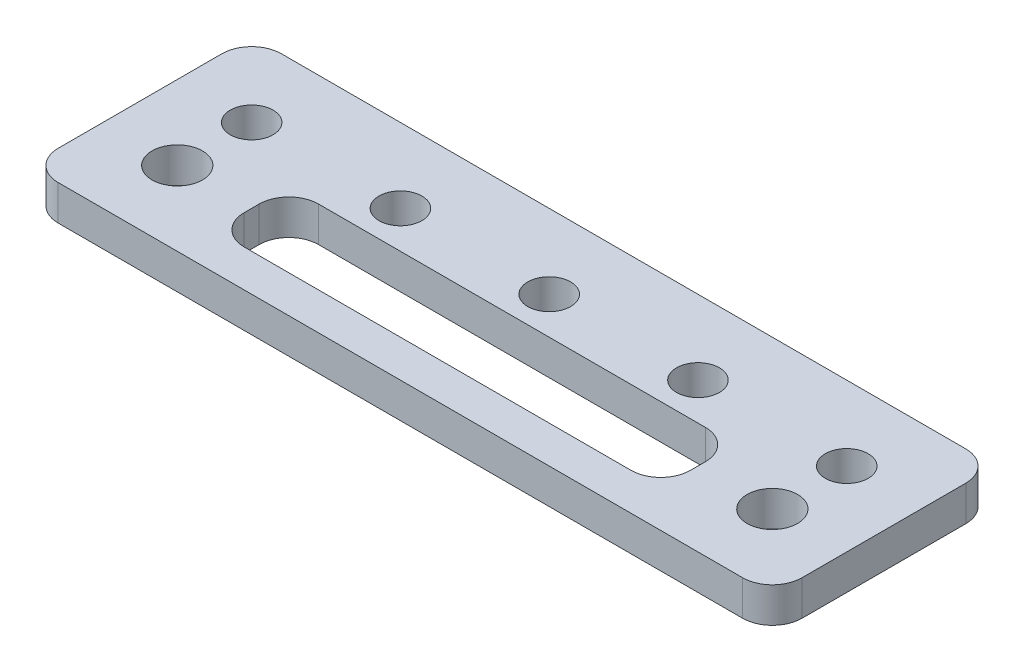
ISO-10303-21;
HEADER;
FILE_DESCRIPTION(('STEP AP214'),'2;1');
FILE_NAME('part.step','',(''),(''),'','','');
FILE_SCHEMA(('AUTOMOTIVE_DESIGN { 1 0 10303 214 1 1 1 1 }'));
ENDSEC;
DATA;
#1=APPLICATION_CONTEXT('core data for automotive mechanical design processes');
#2=APPLICATION_PROTOCOL_DEFINITION('international standard','automotive_design',2000,#1);
#3=PRODUCT_CONTEXT('',#1,'mechanical');
#4=PRODUCT('Part','Part','',(#3));
#5=PRODUCT_RELATED_PRODUCT_CATEGORY('part','',(#4));
#6=PRODUCT_DEFINITION_FORMATION('','',#4);
#7=PRODUCT_DEFINITION_CONTEXT('part definition',#1,'design');
#8=PRODUCT_DEFINITION('design','',#6,#7);
#9=PRODUCT_DEFINITION_SHAPE('','',#8);
#10=(LENGTH_UNIT() NAMED_UNIT(*) SI_UNIT(.MILLI.,.METRE.));
#11=(NAMED_UNIT(*) PLANE_ANGLE_UNIT() SI_UNIT($,.RADIAN.));
#12=(NAMED_UNIT(*) SI_UNIT($,.STERADIAN.) SOLID_ANGLE_UNIT());
#13=UNCERTAINTY_MEASURE_WITH_UNIT(LENGTH_MEASURE(1.E-05),#10,'distance_accuracy_value','');
#14=(GEOMETRIC_REPRESENTATION_CONTEXT(3) GLOBAL_UNCERTAINTY_ASSIGNED_CONTEXT((#13)) GLOBAL_UNIT_ASSIGNED_CONTEXT((#10,
#11,#12)) REPRESENTATION_CONTEXT('',''));
#15=CARTESIAN_POINT('',(0.,0.,0.));
#16=DIRECTION('',(0.,0.,1.));
#17=DIRECTION('',(1.,0.,0.));
#18=AXIS2_PLACEMENT_3D('',#15,#16,#17);
#19=CARTESIAN_POINT('',(-31.75,3.,9.525));
#20=DIRECTION('',(1.,0.,0.));
#21=DIRECTION('',(0.,0.,-1.));
#22=AXIS2_PLACEMENT_3D('',#19,#20,#21);
#23=PLANE('',#22);
#24=DIRECTION('',(0.,0.,1.));
#25=VECTOR('',#24,1.);
#26=CARTESIAN_POINT('',(-31.75,0.,9.525));
#27=LINE('',#26,#25);
#28=CARTESIAN_POINT('',(-31.75,0.,-6.98499999999999));
#29=VERTEX_POINT('',#28);
#30=CARTESIAN_POINT('',(-31.75,0.,6.985));
#31=VERTEX_POINT('',#30);
#32=EDGE_CURVE('E255',#29,#31,#27,.T.);
#33=ORIENTED_EDGE('',*,*,#32,.T.);
#34=DIRECTION('',(0.,-1.,0.));
#35=VECTOR('',#34,1.);
#36=CARTESIAN_POINT('',(-31.75,3.,6.985));
#37=LINE('',#36,#35);
#38=CARTESIAN_POINT('',(-31.75,3.,6.985));
#39=VERTEX_POINT('',#38);
#40=EDGE_CURVE('E11',#31,#39,#37,.F.);
#41=ORIENTED_EDGE('',*,*,#40,.T.);
#42=DIRECTION('',(0.,0.,1.));
#43=VECTOR('',#42,1.);
#44=CARTESIAN_POINT('',(-31.75,3.,9.525));
#45=LINE('',#44,#43);
#46=CARTESIAN_POINT('',(-31.75,3.,-6.98499999999999));
#47=VERTEX_POINT('',#46);
#48=EDGE_CURVE('E256',#47,#39,#45,.T.);
#49=ORIENTED_EDGE('',*,*,#48,.F.);
#50=DIRECTION('',(0.,-1.,0.));
#51=VECTOR('',#50,1.);
#52=CARTESIAN_POINT('',(-31.75,3.,-6.985));
#53=LINE('',#52,#51);
#54=EDGE_CURVE('E41',#47,#29,#53,.T.);
#55=ORIENTED_EDGE('',*,*,#54,.T.);
#56=EDGE_LOOP('',(#33,#41,#49,#55));
#57=FACE_BOUND('',#56,.T.);
#58=ADVANCED_FACE('F33',(#57),#23,.F.);
#59=CARTESIAN_POINT('',(31.75,3.,9.525));
#60=DIRECTION('',(0.,0.,-1.));
#61=DIRECTION('',(-1.,0.,0.));
#62=AXIS2_PLACEMENT_3D('',#59,#60,#61);
#63=PLANE('',#62);
#64=DIRECTION('',(1.,0.,0.));
#65=VECTOR('',#64,1.);
#66=CARTESIAN_POINT('',(31.75,0.,9.525));
#67=LINE('',#66,#65);
#68=CARTESIAN_POINT('',(-29.21,0.,9.525));
#69=VERTEX_POINT('',#68);
#70=CARTESIAN_POINT('',(29.21,0.,9.525));
#71=VERTEX_POINT('',#70);
#72=EDGE_CURVE('E272',#69,#71,#67,.T.);
#73=ORIENTED_EDGE('',*,*,#72,.T.);
#74=DIRECTION('',(0.,-1.,0.));
#75=VECTOR('',#74,1.);
#76=CARTESIAN_POINT('',(29.21,3.,9.525));
#77=LINE('',#76,#75);
#78=CARTESIAN_POINT('',(29.21,3.,9.525));
#79=VERTEX_POINT('',#78);
#80=EDGE_CURVE('E295',#71,#79,#77,.F.);
#81=ORIENTED_EDGE('',*,*,#80,.T.);
#82=DIRECTION('',(1.,0.,0.));
#83=VECTOR('',#82,1.);
#84=CARTESIAN_POINT('',(31.75,3.,9.525));
#85=LINE('',#84,#83);
#86=CARTESIAN_POINT('',(-29.21,3.,9.525));
#87=VERTEX_POINT('',#86);
#88=EDGE_CURVE('E259',#87,#79,#85,.T.);
#89=ORIENTED_EDGE('',*,*,#88,.F.);
#90=DIRECTION('',(0.,-1.,0.));
#91=VECTOR('',#90,1.);
#92=CARTESIAN_POINT('',(-29.21,3.,9.525));
#93=LINE('',#92,#91);
#94=EDGE_CURVE('E292',#87,#69,#93,.T.);
#95=ORIENTED_EDGE('',*,*,#94,.T.);
#96=EDGE_LOOP('',(#73,#81,#89,#95));
#97=FACE_BOUND('',#96,.T.);
#98=ADVANCED_FACE('F327',(#97),#63,.F.);
#99=CARTESIAN_POINT('',(31.75,3.,9.525));
#100=DIRECTION('',(-1.,0.,0.));
#101=DIRECTION('',(0.,0.,1.));
#102=AXIS2_PLACEMENT_3D('',#99,#100,#101);
#103=PLANE('',#102);
#104=DIRECTION('',(0.,0.,-1.));
#105=VECTOR('',#104,1.);
#106=CARTESIAN_POINT('',(31.75,3.,9.525));
#107=LINE('',#106,#105);
#108=CARTESIAN_POINT('',(31.75,3.,6.985));
#109=VERTEX_POINT('',#108);
#110=CARTESIAN_POINT('',(31.75,3.,-6.985));
#111=VERTEX_POINT('',#110);
#112=EDGE_CURVE('E263',#109,#111,#107,.T.);
#113=ORIENTED_EDGE('',*,*,#112,.F.);
#114=DIRECTION('',(0.,-1.,0.));
#115=VECTOR('',#114,1.);
#116=CARTESIAN_POINT('',(31.75,3.,6.98499999999999));
#117=LINE('',#116,#115);
#118=CARTESIAN_POINT('',(31.75,0.,6.985));
#119=VERTEX_POINT('',#118);
#120=EDGE_CURVE('E281',#109,#119,#117,.T.);
#121=ORIENTED_EDGE('',*,*,#120,.T.);
#122=DIRECTION('',(0.,0.,-1.));
#123=VECTOR('',#122,1.);
#124=CARTESIAN_POINT('',(31.75,0.,9.525));
#125=LINE('',#124,#123);
#126=CARTESIAN_POINT('',(31.75,0.,-6.985));
#127=VERTEX_POINT('',#126);
#128=EDGE_CURVE('E275',#119,#127,#125,.T.);
#129=ORIENTED_EDGE('',*,*,#128,.T.);
#130=DIRECTION('',(0.,-1.,0.));
#131=VECTOR('',#130,1.);
#132=CARTESIAN_POINT('',(31.75,3.,-6.985));
#133=LINE('',#132,#131);
#134=EDGE_CURVE('E269',#127,#111,#133,.F.);
#135=ORIENTED_EDGE('',*,*,#134,.T.);
#136=EDGE_LOOP('',(#113,#121,#129,#135));
#137=FACE_BOUND('',#136,.T.);
#138=ADVANCED_FACE('F337',(#137),#103,.F.);
#139=CARTESIAN_POINT('',(31.75,3.,-9.52500000000001));
#140=DIRECTION('',(0.,0.,1.));
#141=DIRECTION('',(1.,0.,0.));
#142=AXIS2_PLACEMENT_3D('',#139,#140,#141);
#143=PLANE('',#142);
#144=DIRECTION('',(-1.,0.,0.));
#145=VECTOR('',#144,1.);
#146=CARTESIAN_POINT('',(31.75,3.,-9.52500000000001));
#147=LINE('',#146,#145);
#148=CARTESIAN_POINT('',(29.21,3.,-9.52500000000001));
#149=VERTEX_POINT('',#148);
#150=CARTESIAN_POINT('',(-29.21,3.,-9.525));
#151=VERTEX_POINT('',#150);
#152=EDGE_CURVE('E266',#149,#151,#147,.T.);
#153=ORIENTED_EDGE('',*,*,#152,.F.);
#154=DIRECTION('',(0.,-1.,0.));
#155=VECTOR('',#154,1.);
#156=CARTESIAN_POINT('',(29.21,3.,-9.52500000000001));
#157=LINE('',#156,#155);
#158=CARTESIAN_POINT('',(29.21,0.,-9.52500000000001));
#159=VERTEX_POINT('',#158);
#160=EDGE_CURVE('E307',#149,#159,#157,.T.);
#161=ORIENTED_EDGE('',*,*,#160,.T.);
#162=DIRECTION('',(-1.,0.,0.));
#163=VECTOR('',#162,1.);
#164=CARTESIAN_POINT('',(31.75,0.,-9.52500000000001));
#165=LINE('',#164,#163);
#166=CARTESIAN_POINT('',(-29.21,0.,-9.525));
#167=VERTEX_POINT('',#166);
#168=EDGE_CURVE('E260',#159,#167,#165,.T.);
#169=ORIENTED_EDGE('',*,*,#168,.T.);
#170=DIRECTION('',(0.,-1.,0.));
#171=VECTOR('',#170,1.);
#172=CARTESIAN_POINT('',(-29.21,3.,-9.525));
#173=LINE('',#172,#171);
#174=EDGE_CURVE('E305',#167,#151,#173,.F.);
#175=ORIENTED_EDGE('',*,*,#174,.T.);
#176=EDGE_LOOP('',(#153,#161,#169,#175));
#177=FACE_BOUND('',#176,.T.);
#178=ADVANCED_FACE('F345',(#177),#143,.F.);
#179=CARTESIAN_POINT('',(0.,3.,0.));
#180=DIRECTION('',(0.,1.,0.));
#181=DIRECTION('',(0.,0.,1.));
#182=AXIS2_PLACEMENT_3D('',#179,#180,#181);
#183=PLANE('',#182);
#184=CARTESIAN_POINT('',(16.51,3.,2.54000000000001));
#185=DIRECTION('',(0.,1.,0.));
#186=DIRECTION('',(0.,0.,1.));
#187=AXIS2_PLACEMENT_3D('',#184,#185,#186);
#188=CIRCLE('',#187,2.54);
#189=CARTESIAN_POINT('',(19.05,3.,2.54000000000001));
#190=VERTEX_POINT('',#189);
#191=CARTESIAN_POINT('',(16.51,3.,0.));
#192=VERTEX_POINT('',#191);
#193=EDGE_CURVE('E48',#190,#192,#188,.T.);
#194=ORIENTED_EDGE('',*,*,#193,.F.);
#195=DIRECTION('',(0.,0.,-1.));
#196=VECTOR('',#195,1.);
#197=CARTESIAN_POINT('',(19.05,3.,3.81));
#198=LINE('',#197,#196);
#199=CARTESIAN_POINT('',(19.05,3.,3.81));
#200=VERTEX_POINT('',#199);
#201=EDGE_CURVE('E164',#200,#190,#198,.T.);
#202=ORIENTED_EDGE('',*,*,#201,.F.);
#203=CARTESIAN_POINT('',(16.51,3.,3.81));
#204=DIRECTION('',(0.,1.,0.));
#205=DIRECTION('',(0.,0.,1.));
#206=AXIS2_PLACEMENT_3D('',#203,#204,#205);
#207=CIRCLE('',#206,2.54);
#208=CARTESIAN_POINT('',(16.51,3.,6.35));
#209=VERTEX_POINT('',#208);
#210=EDGE_CURVE('E167',#209,#200,#207,.T.);
#211=ORIENTED_EDGE('',*,*,#210,.F.);
#212=DIRECTION('',(1.,0.,0.));
#213=VECTOR('',#212,1.);
#214=CARTESIAN_POINT('',(16.51,3.,6.35));
#215=LINE('',#214,#213);
#216=CARTESIAN_POINT('',(-16.51,3.,6.35));
#217=VERTEX_POINT('',#216);
#218=EDGE_CURVE('E195',#217,#209,#215,.T.);
#219=ORIENTED_EDGE('',*,*,#218,.F.);
#220=CARTESIAN_POINT('',(-16.51,3.,3.81));
#221=DIRECTION('',(0.,1.,0.));
#222=DIRECTION('',(0.,0.,-1.));
#223=AXIS2_PLACEMENT_3D('',#220,#221,#222);
#224=CIRCLE('',#223,2.54);
#225=CARTESIAN_POINT('',(-19.05,3.,3.81));
#226=VERTEX_POINT('',#225);
#227=EDGE_CURVE('E192',#226,#217,#224,.T.);
#228=ORIENTED_EDGE('',*,*,#227,.F.);
#229=DIRECTION('',(0.,0.,1.));
#230=VECTOR('',#229,1.);
#231=CARTESIAN_POINT('',(-19.05,3.,3.81));
#232=LINE('',#231,#230);
#233=CARTESIAN_POINT('',(-19.05,3.,2.54000000000001));
#234=VERTEX_POINT('',#233);
#235=EDGE_CURVE('E189',#234,#226,#232,.T.);
#236=ORIENTED_EDGE('',*,*,#235,.F.);
#237=CARTESIAN_POINT('',(-16.51,3.,2.54000000000001));
#238=DIRECTION('',(0.,1.,0.));
#239=DIRECTION('',(0.,0.,1.));
#240=AXIS2_PLACEMENT_3D('',#237,#238,#239);
#241=CIRCLE('',#240,2.54);
#242=CARTESIAN_POINT('',(-16.51,3.,0.));
#243=VERTEX_POINT('',#242);
#244=EDGE_CURVE('E186',#243,#234,#241,.T.);
#245=ORIENTED_EDGE('',*,*,#244,.F.);
#246=DIRECTION('',(-1.,0.,0.));
#247=VECTOR('',#246,1.);
#248=CARTESIAN_POINT('',(16.51,3.,0.));
#249=LINE('',#248,#247);
#250=EDGE_CURVE('E184',#192,#243,#249,.T.);
#251=ORIENTED_EDGE('',*,*,#250,.F.);
#252=EDGE_LOOP('',(#194,#202,#211,#219,#228,#236,#245,#251));
#253=FACE_BOUND('',#252,.T.);
#254=CARTESIAN_POINT('',(-25.4,3.,3.17500000000001));
#255=DIRECTION('',(0.,1.,0.));
#256=DIRECTION('',(0.,0.,1.));
#257=AXIS2_PLACEMENT_3D('',#254,#255,#256);
#258=CIRCLE('',#257,2.15264999999999);
#259=CARTESIAN_POINT('',(-25.4,3.,5.32764999999999));
#260=VERTEX_POINT('',#259);
#261=EDGE_CURVE('E202',#260,#260,#258,.T.);
#262=ORIENTED_EDGE('',*,*,#261,.F.);
#263=EDGE_LOOP('',(#262));
#264=FACE_BOUND('',#263,.T.);
#265=CARTESIAN_POINT('',(25.4,3.,3.175));
#266=DIRECTION('',(0.,1.,0.));
#267=DIRECTION('',(0.,0.,1.));
#268=AXIS2_PLACEMENT_3D('',#265,#266,#267);
#269=CIRCLE('',#268,2.15264999999999);
#270=CARTESIAN_POINT('',(25.4,3.,5.32764999999999));
#271=VERTEX_POINT('',#270);
#272=EDGE_CURVE('E219',#271,#271,#269,.T.);
#273=ORIENTED_EDGE('',*,*,#272,.F.);
#274=EDGE_LOOP('',(#273));
#275=FACE_BOUND('',#274,.T.);
#276=CARTESIAN_POINT('',(-25.4,3.,-3.17499999999999));
#277=DIRECTION('',(0.,1.,0.));
#278=DIRECTION('',(0.,0.,1.));
#279=AXIS2_PLACEMENT_3D('',#276,#277,#278);
#280=CIRCLE('',#279,1.82879999999999);
#281=CARTESIAN_POINT('',(-25.4,3.,-1.34620000000001));
#282=VERTEX_POINT('',#281);
#283=EDGE_CURVE('E225',#282,#282,#280,.T.);
#284=ORIENTED_EDGE('',*,*,#283,.F.);
#285=EDGE_LOOP('',(#284));
#286=FACE_BOUND('',#285,.T.);
#287=CARTESIAN_POINT('',(0.,3.,-3.17499999999999));
#288=DIRECTION('',(0.,1.,0.));
#289=DIRECTION('',(0.,0.,1.));
#290=AXIS2_PLACEMENT_3D('',#287,#288,#289);
#291=CIRCLE('',#290,1.82879999999999);
#292=CARTESIAN_POINT('',(0.,3.,-1.34620000000001));
#293=VERTEX_POINT('',#292);
#294=EDGE_CURVE('E231',#293,#293,#291,.T.);
#295=ORIENTED_EDGE('',*,*,#294,.F.);
#296=EDGE_LOOP('',(#295));
#297=FACE_BOUND('',#296,.T.);
#298=CARTESIAN_POINT('',(25.4,3.,-3.17499999999999));
#299=DIRECTION('',(0.,1.,0.));
#300=DIRECTION('',(0.,0.,1.));
#301=AXIS2_PLACEMENT_3D('',#298,#299,#300);
#302=CIRCLE('',#301,1.82879999999999);
#303=CARTESIAN_POINT('',(25.4,3.,-1.34620000000001));
#304=VERTEX_POINT('',#303);
#305=EDGE_CURVE('E237',#304,#304,#302,.T.);
#306=ORIENTED_EDGE('',*,*,#305,.F.);
#307=EDGE_LOOP('',(#306));
#308=FACE_BOUND('',#307,.T.);
#309=CARTESIAN_POINT('',(12.7,3.,-3.17499999999999));
#310=DIRECTION('',(0.,1.,0.));
#311=DIRECTION('',(0.,0.,1.));
#312=AXIS2_PLACEMENT_3D('',#309,#310,#311);
#313=CIRCLE('',#312,1.82879999999999);
#314=CARTESIAN_POINT('',(12.7,3.,-1.34620000000001));
#315=VERTEX_POINT('',#314);
#316=EDGE_CURVE('E243',#315,#315,#313,.T.);
#317=ORIENTED_EDGE('',*,*,#316,.F.);
#318=EDGE_LOOP('',(#317));
#319=FACE_BOUND('',#318,.T.);
#320=CARTESIAN_POINT('',(-12.7,3.,-3.17499999999999));
#321=DIRECTION('',(0.,1.,0.));
#322=DIRECTION('',(0.,0.,1.));
#323=AXIS2_PLACEMENT_3D('',#320,#321,#322);
#324=CIRCLE('',#323,1.82879999999999);
#325=CARTESIAN_POINT('',(-12.7,3.,-1.34620000000001));
#326=VERTEX_POINT('',#325);
#327=EDGE_CURVE('E249',#326,#326,#324,.T.);
#328=ORIENTED_EDGE('',*,*,#327,.F.);
#329=EDGE_LOOP('',(#328));
#330=FACE_BOUND('',#329,.T.);
#331=ORIENTED_EDGE('',*,*,#88,.T.);
#332=CARTESIAN_POINT('',(29.21,3.,6.98499999999999));
#333=DIRECTION('',(0.,1.,0.));
#334=DIRECTION('',(0.,0.,1.));
#335=AXIS2_PLACEMENT_3D('',#332,#333,#334);
#336=CIRCLE('',#335,2.54);
#337=EDGE_CURVE('E303',#79,#109,#336,.T.);
#338=ORIENTED_EDGE('',*,*,#337,.T.);
#339=ORIENTED_EDGE('',*,*,#112,.T.);
#340=CARTESIAN_POINT('',(29.21,3.,-6.985));
#341=DIRECTION('',(0.,1.,0.));
#342=DIRECTION('',(0.,0.,1.));
#343=AXIS2_PLACEMENT_3D('',#340,#341,#342);
#344=CIRCLE('',#343,2.54);
#345=EDGE_CURVE('E301',#111,#149,#344,.T.);
#346=ORIENTED_EDGE('',*,*,#345,.T.);
#347=ORIENTED_EDGE('',*,*,#152,.T.);
#348=CARTESIAN_POINT('',(-29.21,3.,-6.985));
#349=DIRECTION('',(0.,1.,0.));
#350=DIRECTION('',(0.,0.,1.));
#351=AXIS2_PLACEMENT_3D('',#348,#349,#350);
#352=CIRCLE('',#351,2.54);
#353=EDGE_CURVE('E297',#151,#47,#352,.T.);
#354=ORIENTED_EDGE('',*,*,#353,.T.);
#355=ORIENTED_EDGE('',*,*,#48,.T.);
#356=CARTESIAN_POINT('',(-29.21,3.,6.985));
#357=DIRECTION('',(0.,1.,0.));
#358=DIRECTION('',(0.,0.,1.));
#359=AXIS2_PLACEMENT_3D('',#356,#357,#358);
#360=CIRCLE('',#359,2.54);
#361=EDGE_CURVE('E299',#39,#87,#360,.T.);
#362=ORIENTED_EDGE('',*,*,#361,.T.);
#363=EDGE_LOOP('',(#331,#338,#339,#346,#347,#354,#355,#362));
#364=FACE_BOUND('',#363,.T.);
#365=ADVANCED_FACE('F331',(#253,#264,#275,#286,#297,#308,#319,#330,#364),#183,.T.);
#366=CARTESIAN_POINT('',(0.,0.,0.));
#367=DIRECTION('',(0.,1.,0.));
#368=DIRECTION('',(0.,0.,1.));
#369=AXIS2_PLACEMENT_3D('',#366,#367,#368);
#370=PLANE('',#369);
#371=DIRECTION('',(0.,0.,-1.));
#372=VECTOR('',#371,1.);
#373=CARTESIAN_POINT('',(19.05,0.,3.81));
#374=LINE('',#373,#372);
#375=CARTESIAN_POINT('',(19.05,0.,3.81));
#376=VERTEX_POINT('',#375);
#377=CARTESIAN_POINT('',(19.05,0.,2.54000000000001));
#378=VERTEX_POINT('',#377);
#379=EDGE_CURVE('E153',#376,#378,#374,.T.);
#380=ORIENTED_EDGE('',*,*,#379,.T.);
#381=CARTESIAN_POINT('',(16.51,0.,2.54000000000001));
#382=DIRECTION('',(0.,1.,0.));
#383=DIRECTION('',(0.,0.,1.));
#384=AXIS2_PLACEMENT_3D('',#381,#382,#383);
#385=CIRCLE('',#384,2.54);
#386=CARTESIAN_POINT('',(16.51,0.,0.));
#387=VERTEX_POINT('',#386);
#388=EDGE_CURVE('E147',#378,#387,#385,.T.);
#389=ORIENTED_EDGE('',*,*,#388,.T.);
#390=DIRECTION('',(-1.,0.,0.));
#391=VECTOR('',#390,1.);
#392=CARTESIAN_POINT('',(16.51,0.,0.));
#393=LINE('',#392,#391);
#394=CARTESIAN_POINT('',(-16.51,0.,0.));
#395=VERTEX_POINT('',#394);
#396=EDGE_CURVE('E156',#387,#395,#393,.T.);
#397=ORIENTED_EDGE('',*,*,#396,.T.);
#398=CARTESIAN_POINT('',(-16.51,0.,2.54000000000001));
#399=DIRECTION('',(0.,1.,0.));
#400=DIRECTION('',(0.,0.,1.));
#401=AXIS2_PLACEMENT_3D('',#398,#399,#400);
#402=CIRCLE('',#401,2.54);
#403=CARTESIAN_POINT('',(-19.05,0.,2.54000000000001));
#404=VERTEX_POINT('',#403);
#405=EDGE_CURVE('E56',#395,#404,#402,.T.);
#406=ORIENTED_EDGE('',*,*,#405,.T.);
#407=DIRECTION('',(0.,0.,1.));
#408=VECTOR('',#407,1.);
#409=CARTESIAN_POINT('',(-19.05,0.,3.81));
#410=LINE('',#409,#408);
#411=CARTESIAN_POINT('',(-19.05,0.,3.81));
#412=VERTEX_POINT('',#411);
#413=EDGE_CURVE('E171',#404,#412,#410,.T.);
#414=ORIENTED_EDGE('',*,*,#413,.T.);
#415=CARTESIAN_POINT('',(-16.51,0.,3.81));
#416=DIRECTION('',(0.,1.,0.));
#417=DIRECTION('',(0.,0.,-1.));
#418=AXIS2_PLACEMENT_3D('',#415,#416,#417);
#419=CIRCLE('',#418,2.54);
#420=CARTESIAN_POINT('',(-16.51,0.,6.35));
#421=VERTEX_POINT('',#420);
#422=EDGE_CURVE('E174',#412,#421,#419,.T.);
#423=ORIENTED_EDGE('',*,*,#422,.T.);
#424=DIRECTION('',(1.,0.,0.));
#425=VECTOR('',#424,1.);
#426=CARTESIAN_POINT('',(16.51,0.,6.35));
#427=LINE('',#426,#425);
#428=CARTESIAN_POINT('',(16.51,0.,6.35));
#429=VERTEX_POINT('',#428);
#430=EDGE_CURVE('E177',#421,#429,#427,.T.);
#431=ORIENTED_EDGE('',*,*,#430,.T.);
#432=CARTESIAN_POINT('',(16.51,0.,3.81));
#433=DIRECTION('',(0.,1.,0.));
#434=DIRECTION('',(0.,0.,1.));
#435=AXIS2_PLACEMENT_3D('',#432,#433,#434);
#436=CIRCLE('',#435,2.54);
#437=EDGE_CURVE('E180',#429,#376,#436,.T.);
#438=ORIENTED_EDGE('',*,*,#437,.T.);
#439=EDGE_LOOP('',(#380,#389,#397,#406,#414,#423,#431,#438));
#440=FACE_BOUND('',#439,.T.);
#441=CARTESIAN_POINT('',(-25.4,0.,3.17500000000001));
#442=DIRECTION('',(0.,1.,0.));
#443=DIRECTION('',(0.,0.,1.));
#444=AXIS2_PLACEMENT_3D('',#441,#442,#443);
#445=CIRCLE('',#444,2.15265);
#446=CARTESIAN_POINT('',(-25.4,0.,5.32765));
#447=VERTEX_POINT('',#446);
#448=EDGE_CURVE('E216',#447,#447,#445,.T.);
#449=ORIENTED_EDGE('',*,*,#448,.T.);
#450=EDGE_LOOP('',(#449));
#451=FACE_BOUND('',#450,.T.);
#452=CARTESIAN_POINT('',(25.4,0.,3.175));
#453=DIRECTION('',(0.,1.,0.));
#454=DIRECTION('',(0.,0.,1.));
#455=AXIS2_PLACEMENT_3D('',#452,#453,#454);
#456=CIRCLE('',#455,2.15265);
#457=CARTESIAN_POINT('',(25.4,0.,5.32765));
#458=VERTEX_POINT('',#457);
#459=EDGE_CURVE('E222',#458,#458,#456,.T.);
#460=ORIENTED_EDGE('',*,*,#459,.T.);
#461=EDGE_LOOP('',(#460));
#462=FACE_BOUND('',#461,.T.);
#463=CARTESIAN_POINT('',(-25.4,0.,-3.17499999999999));
#464=DIRECTION('',(0.,1.,0.));
#465=DIRECTION('',(0.,0.,1.));
#466=AXIS2_PLACEMENT_3D('',#463,#464,#465);
#467=CIRCLE('',#466,1.8288);
#468=CARTESIAN_POINT('',(-25.4,0.,-1.3462));
#469=VERTEX_POINT('',#468);
#470=EDGE_CURVE('E228',#469,#469,#467,.T.);
#471=ORIENTED_EDGE('',*,*,#470,.T.);
#472=EDGE_LOOP('',(#471));
#473=FACE_BOUND('',#472,.T.);
#474=CARTESIAN_POINT('',(0.,0.,-3.17499999999999));
#475=DIRECTION('',(0.,1.,0.));
#476=DIRECTION('',(0.,0.,1.));
#477=AXIS2_PLACEMENT_3D('',#474,#475,#476);
#478=CIRCLE('',#477,1.8288);
#479=CARTESIAN_POINT('',(0.,0.,-1.34619999999999));
#480=VERTEX_POINT('',#479);
#481=EDGE_CURVE('E234',#480,#480,#478,.T.);
#482=ORIENTED_EDGE('',*,*,#481,.T.);
#483=EDGE_LOOP('',(#482));
#484=FACE_BOUND('',#483,.T.);
#485=CARTESIAN_POINT('',(25.4,0.,-3.17499999999999));
#486=DIRECTION('',(0.,1.,0.));
#487=DIRECTION('',(0.,0.,1.));
#488=AXIS2_PLACEMENT_3D('',#485,#486,#487);
#489=CIRCLE('',#488,1.8288);
#490=CARTESIAN_POINT('',(25.4,0.,-1.3462));
#491=VERTEX_POINT('',#490);
#492=EDGE_CURVE('E240',#491,#491,#489,.T.);
#493=ORIENTED_EDGE('',*,*,#492,.T.);
#494=EDGE_LOOP('',(#493));
#495=FACE_BOUND('',#494,.T.);
#496=CARTESIAN_POINT('',(12.7,0.,-3.17499999999999));
#497=DIRECTION('',(0.,1.,0.));
#498=DIRECTION('',(0.,0.,1.));
#499=AXIS2_PLACEMENT_3D('',#496,#497,#498);
#500=CIRCLE('',#499,1.8288);
#501=CARTESIAN_POINT('',(12.7,0.,-1.3462));
#502=VERTEX_POINT('',#501);
#503=EDGE_CURVE('E246',#502,#502,#500,.T.);
#504=ORIENTED_EDGE('',*,*,#503,.T.);
#505=EDGE_LOOP('',(#504));
#506=FACE_BOUND('',#505,.T.);
#507=CARTESIAN_POINT('',(-12.7,0.,-3.17499999999999));
#508=DIRECTION('',(0.,1.,0.));
#509=DIRECTION('',(0.,0.,1.));
#510=AXIS2_PLACEMENT_3D('',#507,#508,#509);
#511=CIRCLE('',#510,1.8288);
#512=CARTESIAN_POINT('',(-12.7,0.,-1.3462));
#513=VERTEX_POINT('',#512);
#514=EDGE_CURVE('E252',#513,#513,#511,.T.);
#515=ORIENTED_EDGE('',*,*,#514,.T.);
#516=EDGE_LOOP('',(#515));
#517=FACE_BOUND('',#516,.T.);
#518=ORIENTED_EDGE('',*,*,#128,.F.);
#519=CARTESIAN_POINT('',(29.21,0.,6.98499999999999));
#520=DIRECTION('',(0.,1.,0.));
#521=DIRECTION('',(0.,0.,1.));
#522=AXIS2_PLACEMENT_3D('',#519,#520,#521);
#523=CIRCLE('',#522,2.54);
#524=EDGE_CURVE('E290',#119,#71,#523,.F.);
#525=ORIENTED_EDGE('',*,*,#524,.T.);
#526=ORIENTED_EDGE('',*,*,#72,.F.);
#527=CARTESIAN_POINT('',(-29.21,0.,6.985));
#528=DIRECTION('',(0.,1.,0.));
#529=DIRECTION('',(0.,0.,1.));
#530=AXIS2_PLACEMENT_3D('',#527,#528,#529);
#531=CIRCLE('',#530,2.54);
#532=EDGE_CURVE('E286',#69,#31,#531,.F.);
#533=ORIENTED_EDGE('',*,*,#532,.T.);
#534=ORIENTED_EDGE('',*,*,#32,.F.);
#535=CARTESIAN_POINT('',(-29.21,0.,-6.985));
#536=DIRECTION('',(0.,1.,0.));
#537=DIRECTION('',(0.,0.,1.));
#538=AXIS2_PLACEMENT_3D('',#535,#536,#537);
#539=CIRCLE('',#538,2.54);
#540=EDGE_CURVE('E284',#29,#167,#539,.F.);
#541=ORIENTED_EDGE('',*,*,#540,.T.);
#542=ORIENTED_EDGE('',*,*,#168,.F.);
#543=CARTESIAN_POINT('',(29.21,0.,-6.985));
#544=DIRECTION('',(0.,1.,0.));
#545=DIRECTION('',(0.,0.,1.));
#546=AXIS2_PLACEMENT_3D('',#543,#544,#545);
#547=CIRCLE('',#546,2.54);
#548=EDGE_CURVE('E288',#159,#127,#547,.F.);
#549=ORIENTED_EDGE('',*,*,#548,.T.);
#550=EDGE_LOOP('',(#518,#525,#526,#533,#534,#541,#542,#549));
#551=FACE_BOUND('',#550,.T.);
#552=ADVANCED_FACE('F160',(#440,#451,#462,#473,#484,#495,#506,#517,#551),#370,.F.);
#553=CARTESIAN_POINT('',(-12.7,3.,-3.17499999999999));
#554=DIRECTION('',(0.,1.,0.));
#555=DIRECTION('',(0.,0.,1.));
#556=AXIS2_PLACEMENT_3D('',#553,#554,#555);
#557=CYLINDRICAL_SURFACE('',#556,1.82879999999999);
#558=ORIENTED_EDGE('',*,*,#514,.F.);
#559=EDGE_LOOP('',(#558));
#560=FACE_BOUND('',#559,.T.);
#561=ORIENTED_EDGE('',*,*,#327,.T.);
#562=EDGE_LOOP('',(#561));
#563=FACE_BOUND('',#562,.T.);
#564=ADVANCED_FACE('F396',(#560,#563),#557,.F.);
#565=CARTESIAN_POINT('',(12.7,3.,-3.17499999999999));
#566=DIRECTION('',(0.,1.,0.));
#567=DIRECTION('',(0.,0.,1.));
#568=AXIS2_PLACEMENT_3D('',#565,#566,#567);
#569=CYLINDRICAL_SURFACE('',#568,1.82879999999999);
#570=ORIENTED_EDGE('',*,*,#503,.F.);
#571=EDGE_LOOP('',(#570));
#572=FACE_BOUND('',#571,.T.);
#573=ORIENTED_EDGE('',*,*,#316,.T.);
#574=EDGE_LOOP('',(#573));
#575=FACE_BOUND('',#574,.T.);
#576=ADVANCED_FACE('F489',(#572,#575),#569,.F.);
#577=CARTESIAN_POINT('',(25.4,3.,-3.17499999999999));
#578=DIRECTION('',(0.,1.,0.));
#579=DIRECTION('',(0.,0.,1.));
#580=AXIS2_PLACEMENT_3D('',#577,#578,#579);
#581=CYLINDRICAL_SURFACE('',#580,1.82879999999999);
#582=ORIENTED_EDGE('',*,*,#492,.F.);
#583=EDGE_LOOP('',(#582));
#584=FACE_BOUND('',#583,.T.);
#585=ORIENTED_EDGE('',*,*,#305,.T.);
#586=EDGE_LOOP('',(#585));
#587=FACE_BOUND('',#586,.T.);
#588=ADVANCED_FACE('F485',(#584,#587),#581,.F.);
#589=CARTESIAN_POINT('',(0.,3.,-3.17499999999999));
#590=DIRECTION('',(0.,1.,0.));
#591=DIRECTION('',(0.,0.,1.));
#592=AXIS2_PLACEMENT_3D('',#589,#590,#591);
#593=CYLINDRICAL_SURFACE('',#592,1.82879999999999);
#594=ORIENTED_EDGE('',*,*,#481,.F.);
#595=EDGE_LOOP('',(#594));
#596=FACE_BOUND('',#595,.T.);
#597=ORIENTED_EDGE('',*,*,#294,.T.);
#598=EDGE_LOOP('',(#597));
#599=FACE_BOUND('',#598,.T.);
#600=ADVANCED_FACE('F481',(#596,#599),#593,.F.);
#601=CARTESIAN_POINT('',(-25.4,3.,-3.17499999999999));
#602=DIRECTION('',(0.,1.,0.));
#603=DIRECTION('',(0.,0.,1.));
#604=AXIS2_PLACEMENT_3D('',#601,#602,#603);
#605=CYLINDRICAL_SURFACE('',#604,1.82879999999999);
#606=ORIENTED_EDGE('',*,*,#470,.F.);
#607=EDGE_LOOP('',(#606));
#608=FACE_BOUND('',#607,.T.);
#609=ORIENTED_EDGE('',*,*,#283,.T.);
#610=EDGE_LOOP('',(#609));
#611=FACE_BOUND('',#610,.T.);
#612=ADVANCED_FACE('F477',(#608,#611),#605,.F.);
#613=CARTESIAN_POINT('',(25.4,3.,3.175));
#614=DIRECTION('',(0.,1.,0.));
#615=DIRECTION('',(0.,0.,1.));
#616=AXIS2_PLACEMENT_3D('',#613,#614,#615);
#617=CYLINDRICAL_SURFACE('',#616,2.15264999999999);
#618=ORIENTED_EDGE('',*,*,#459,.F.);
#619=EDGE_LOOP('',(#618));
#620=FACE_BOUND('',#619,.T.);
#621=ORIENTED_EDGE('',*,*,#272,.T.);
#622=EDGE_LOOP('',(#621));
#623=FACE_BOUND('',#622,.T.);
#624=ADVANCED_FACE('F473',(#620,#623),#617,.F.);
#625=CARTESIAN_POINT('',(-25.4,3.,3.17500000000001));
#626=DIRECTION('',(0.,1.,0.));
#627=DIRECTION('',(0.,0.,1.));
#628=AXIS2_PLACEMENT_3D('',#625,#626,#627);
#629=CYLINDRICAL_SURFACE('',#628,2.15264999999999);
#630=ORIENTED_EDGE('',*,*,#448,.F.);
#631=EDGE_LOOP('',(#630));
#632=FACE_BOUND('',#631,.T.);
#633=ORIENTED_EDGE('',*,*,#261,.T.);
#634=EDGE_LOOP('',(#633));
#635=FACE_BOUND('',#634,.T.);
#636=ADVANCED_FACE('F364',(#632,#635),#629,.F.);
#637=CARTESIAN_POINT('',(29.21,3.,6.98499999999999));
#638=DIRECTION('',(0.,-1.,0.));
#639=DIRECTION('',(0.,0.,-1.));
#640=AXIS2_PLACEMENT_3D('',#637,#638,#639);
#641=CYLINDRICAL_SURFACE('',#640,2.54);
#642=ORIENTED_EDGE('',*,*,#337,.F.);
#643=ORIENTED_EDGE('',*,*,#80,.F.);
#644=ORIENTED_EDGE('',*,*,#524,.F.);
#645=ORIENTED_EDGE('',*,*,#120,.F.);
#646=EDGE_LOOP('',(#642,#643,#644,#645));
#647=FACE_BOUND('',#646,.T.);
#648=ADVANCED_FACE('F335',(#647),#641,.T.);
#649=CARTESIAN_POINT('',(29.21,3.,-6.985));
#650=DIRECTION('',(0.,-1.,0.));
#651=DIRECTION('',(0.,0.,-1.));
#652=AXIS2_PLACEMENT_3D('',#649,#650,#651);
#653=CYLINDRICAL_SURFACE('',#652,2.54);
#654=ORIENTED_EDGE('',*,*,#345,.F.);
#655=ORIENTED_EDGE('',*,*,#134,.F.);
#656=ORIENTED_EDGE('',*,*,#548,.F.);
#657=ORIENTED_EDGE('',*,*,#160,.F.);
#658=EDGE_LOOP('',(#654,#655,#656,#657));
#659=FACE_BOUND('',#658,.T.);
#660=ADVANCED_FACE('F342',(#659),#653,.T.);
#661=CARTESIAN_POINT('',(-29.21,3.,6.985));
#662=DIRECTION('',(0.,-1.,0.));
#663=DIRECTION('',(0.,0.,-1.));
#664=AXIS2_PLACEMENT_3D('',#661,#662,#663);
#665=CYLINDRICAL_SURFACE('',#664,2.54);
#666=ORIENTED_EDGE('',*,*,#361,.F.);
#667=ORIENTED_EDGE('',*,*,#40,.F.);
#668=ORIENTED_EDGE('',*,*,#532,.F.);
#669=ORIENTED_EDGE('',*,*,#94,.F.);
#670=EDGE_LOOP('',(#666,#667,#668,#669));
#671=FACE_BOUND('',#670,.T.);
#672=ADVANCED_FACE('F324',(#671),#665,.T.);
#673=CARTESIAN_POINT('',(-29.21,3.,-6.985));
#674=DIRECTION('',(0.,-1.,0.));
#675=DIRECTION('',(0.,0.,-1.));
#676=AXIS2_PLACEMENT_3D('',#673,#674,#675);
#677=CYLINDRICAL_SURFACE('',#676,2.54);
#678=ORIENTED_EDGE('',*,*,#353,.F.);
#679=ORIENTED_EDGE('',*,*,#174,.F.);
#680=ORIENTED_EDGE('',*,*,#540,.F.);
#681=ORIENTED_EDGE('',*,*,#54,.F.);
#682=EDGE_LOOP('',(#678,#679,#680,#681));
#683=FACE_BOUND('',#682,.T.);
#684=ADVANCED_FACE('F35',(#683),#677,.T.);
#685=CARTESIAN_POINT('',(16.51,0.,2.54000000000001));
#686=DIRECTION('',(0.,1.,0.));
#687=DIRECTION('',(0.,0.,1.));
#688=AXIS2_PLACEMENT_3D('',#685,#686,#687);
#689=CYLINDRICAL_SURFACE('',#688,2.54);
#690=ORIENTED_EDGE('',*,*,#193,.T.);
#691=DIRECTION('',(0.,1.,0.));
#692=VECTOR('',#691,1.);
#693=CARTESIAN_POINT('',(16.51,0.,0.));
#694=LINE('',#693,#692);
#695=EDGE_CURVE('E143',#387,#192,#694,.T.);
#696=ORIENTED_EDGE('',*,*,#695,.F.);
#697=ORIENTED_EDGE('',*,*,#388,.F.);
#698=DIRECTION('',(0.,1.,0.));
#699=VECTOR('',#698,1.);
#700=CARTESIAN_POINT('',(19.05,0.,2.54000000000001));
#701=LINE('',#700,#699);
#702=EDGE_CURVE('E200',#378,#190,#701,.T.);
#703=ORIENTED_EDGE('',*,*,#702,.T.);
#704=EDGE_LOOP('',(#690,#696,#697,#703));
#705=FACE_BOUND('',#704,.T.);
#706=ADVANCED_FACE('F145',(#705),#689,.F.);
#707=CARTESIAN_POINT('',(19.05,0.,3.81));
#708=DIRECTION('',(1.,0.,0.));
#709=DIRECTION('',(0.,0.,-1.));
#710=AXIS2_PLACEMENT_3D('',#707,#708,#709);
#711=PLANE('',#710);
#712=ORIENTED_EDGE('',*,*,#201,.T.);
#713=ORIENTED_EDGE('',*,*,#702,.F.);
#714=ORIENTED_EDGE('',*,*,#379,.F.);
#715=DIRECTION('',(0.,1.,0.));
#716=VECTOR('',#715,1.);
#717=CARTESIAN_POINT('',(19.05,0.,3.81));
#718=LINE('',#717,#716);
#719=EDGE_CURVE('E203',#376,#200,#718,.T.);
#720=ORIENTED_EDGE('',*,*,#719,.T.);
#721=EDGE_LOOP('',(#712,#713,#714,#720));
#722=FACE_BOUND('',#721,.T.);
#723=ADVANCED_FACE('F352',(#722),#711,.F.);
#724=CARTESIAN_POINT('',(16.51,0.,3.81));
#725=DIRECTION('',(0.,1.,0.));
#726=DIRECTION('',(0.,0.,1.));
#727=AXIS2_PLACEMENT_3D('',#724,#725,#726);
#728=CYLINDRICAL_SURFACE('',#727,2.54);
#729=ORIENTED_EDGE('',*,*,#210,.T.);
#730=ORIENTED_EDGE('',*,*,#719,.F.);
#731=ORIENTED_EDGE('',*,*,#437,.F.);
#732=DIRECTION('',(0.,1.,0.));
#733=VECTOR('',#732,1.);
#734=CARTESIAN_POINT('',(16.51,0.,6.35));
#735=LINE('',#734,#733);
#736=EDGE_CURVE('E205',#429,#209,#735,.T.);
#737=ORIENTED_EDGE('',*,*,#736,.T.);
#738=EDGE_LOOP('',(#729,#730,#731,#737));
#739=FACE_BOUND('',#738,.T.);
#740=ADVANCED_FACE('F410',(#739),#728,.F.);
#741=CARTESIAN_POINT('',(16.51,0.,6.35));
#742=DIRECTION('',(0.,0.,1.));
#743=DIRECTION('',(1.,0.,0.));
#744=AXIS2_PLACEMENT_3D('',#741,#742,#743);
#745=PLANE('',#744);
#746=ORIENTED_EDGE('',*,*,#218,.T.);
#747=ORIENTED_EDGE('',*,*,#736,.F.);
#748=ORIENTED_EDGE('',*,*,#430,.F.);
#749=DIRECTION('',(0.,1.,0.));
#750=VECTOR('',#749,1.);
#751=CARTESIAN_POINT('',(-16.51,0.,6.35));
#752=LINE('',#751,#750);
#753=EDGE_CURVE('E207',#421,#217,#752,.T.);
#754=ORIENTED_EDGE('',*,*,#753,.T.);
#755=EDGE_LOOP('',(#746,#747,#748,#754));
#756=FACE_BOUND('',#755,.T.);
#757=ADVANCED_FACE('F420',(#756),#745,.F.);
#758=CARTESIAN_POINT('',(-16.51,0.,3.81));
#759=DIRECTION('',(0.,1.,0.));
#760=DIRECTION('',(0.,0.,1.));
#761=AXIS2_PLACEMENT_3D('',#758,#759,#760);
#762=CYLINDRICAL_SURFACE('',#761,2.54);
#763=ORIENTED_EDGE('',*,*,#227,.T.);
#764=ORIENTED_EDGE('',*,*,#753,.F.);
#765=ORIENTED_EDGE('',*,*,#422,.F.);
#766=DIRECTION('',(0.,1.,0.));
#767=VECTOR('',#766,1.);
#768=CARTESIAN_POINT('',(-19.05,0.,3.81));
#769=LINE('',#768,#767);
#770=EDGE_CURVE('E209',#412,#226,#769,.T.);
#771=ORIENTED_EDGE('',*,*,#770,.T.);
#772=EDGE_LOOP('',(#763,#764,#765,#771));
#773=FACE_BOUND('',#772,.T.);
#774=ADVANCED_FACE('F430',(#773),#762,.F.);
#775=CARTESIAN_POINT('',(-19.05,0.,3.81));
#776=DIRECTION('',(-1.,0.,0.));
#777=DIRECTION('',(0.,0.,1.));
#778=AXIS2_PLACEMENT_3D('',#775,#776,#777);
#779=PLANE('',#778);
#780=ORIENTED_EDGE('',*,*,#235,.T.);
#781=ORIENTED_EDGE('',*,*,#770,.F.);
#782=ORIENTED_EDGE('',*,*,#413,.F.);
#783=DIRECTION('',(0.,1.,0.));
#784=VECTOR('',#783,1.);
#785=CARTESIAN_POINT('',(-19.05,0.,2.54000000000001));
#786=LINE('',#785,#784);
#787=EDGE_CURVE('E211',#404,#234,#786,.T.);
#788=ORIENTED_EDGE('',*,*,#787,.T.);
#789=EDGE_LOOP('',(#780,#781,#782,#788));
#790=FACE_BOUND('',#789,.T.);
#791=ADVANCED_FACE('F440',(#790),#779,.F.);
#792=CARTESIAN_POINT('',(-16.51,0.,2.54000000000001));
#793=DIRECTION('',(0.,1.,0.));
#794=DIRECTION('',(0.,0.,1.));
#795=AXIS2_PLACEMENT_3D('',#792,#793,#794);
#796=CYLINDRICAL_SURFACE('',#795,2.54);
#797=ORIENTED_EDGE('',*,*,#244,.T.);
#798=ORIENTED_EDGE('',*,*,#787,.F.);
#799=ORIENTED_EDGE('',*,*,#405,.F.);
#800=DIRECTION('',(0.,1.,0.));
#801=VECTOR('',#800,1.);
#802=CARTESIAN_POINT('',(-16.51,0.,0.));
#803=LINE('',#802,#801);
#804=EDGE_CURVE('E152',#395,#243,#803,.T.);
#805=ORIENTED_EDGE('',*,*,#804,.T.);
#806=EDGE_LOOP('',(#797,#798,#799,#805));
#807=FACE_BOUND('',#806,.T.);
#808=ADVANCED_FACE('F450',(#807),#796,.F.);
#809=CARTESIAN_POINT('',(16.51,0.,0.));
#810=DIRECTION('',(0.,0.,-1.));
#811=DIRECTION('',(-1.,0.,0.));
#812=AXIS2_PLACEMENT_3D('',#809,#810,#811);
#813=PLANE('',#812);
#814=ORIENTED_EDGE('',*,*,#250,.T.);
#815=ORIENTED_EDGE('',*,*,#804,.F.);
#816=ORIENTED_EDGE('',*,*,#396,.F.);
#817=ORIENTED_EDGE('',*,*,#695,.T.);
#818=EDGE_LOOP('',(#814,#815,#816,#817));
#819=FACE_BOUND('',#818,.T.);
#820=ADVANCED_FACE('F157',(#819),#813,.F.);
#821=CLOSED_SHELL('',(#58,#98,#138,#178,#365,#552,#564,#576,#588,#600,#612,#624,#636,#648,#660,
#672,#684,#706,#723,#740,#757,#774,#791,#808,#820));
#822=MANIFOLD_SOLID_BREP('B2',#821);
#823=ADVANCED_BREP_SHAPE_REPRESENTATION('',(#18,#822),#14);
#824=SHAPE_DEFINITION_REPRESENTATION(#9,#823);
ENDSEC;
END-ISO-10303-21;
